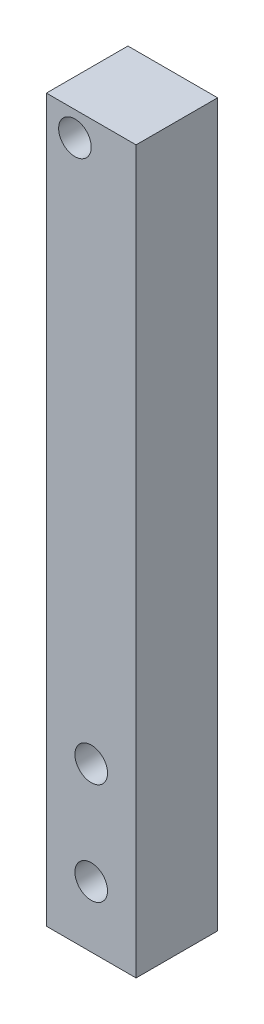
ISO-10303-21;
HEADER;
FILE_DESCRIPTION(('STEP AP214'),'2;1');
FILE_NAME('part.step','',(''),(''),'','','');
FILE_SCHEMA(('AUTOMOTIVE_DESIGN { 1 0 10303 214 1 1 1 1 }'));
ENDSEC;
DATA;
#1=APPLICATION_CONTEXT('core data for automotive mechanical design processes');
#2=APPLICATION_PROTOCOL_DEFINITION('international standard','automotive_design',2000,#1);
#3=PRODUCT_CONTEXT('',#1,'mechanical');
#4=PRODUCT('Part','Part','',(#3));
#5=PRODUCT_RELATED_PRODUCT_CATEGORY('part','',(#4));
#6=PRODUCT_DEFINITION_FORMATION('','',#4);
#7=PRODUCT_DEFINITION_CONTEXT('part definition',#1,'design');
#8=PRODUCT_DEFINITION('design','',#6,#7);
#9=PRODUCT_DEFINITION_SHAPE('','',#8);
#10=(LENGTH_UNIT() NAMED_UNIT(*) SI_UNIT(.MILLI.,.METRE.));
#11=(NAMED_UNIT(*) PLANE_ANGLE_UNIT() SI_UNIT($,.RADIAN.));
#12=(NAMED_UNIT(*) SI_UNIT($,.STERADIAN.) SOLID_ANGLE_UNIT());
#13=UNCERTAINTY_MEASURE_WITH_UNIT(LENGTH_MEASURE(1.E-05),#10,'distance_accuracy_value','');
#14=(GEOMETRIC_REPRESENTATION_CONTEXT(3) GLOBAL_UNCERTAINTY_ASSIGNED_CONTEXT((#13)) GLOBAL_UNIT_ASSIGNED_CONTEXT((#10,
#11,#12)) REPRESENTATION_CONTEXT('',''));
#15=CARTESIAN_POINT('',(0.,0.,0.));
#16=DIRECTION('',(0.,0.,1.));
#17=DIRECTION('',(1.,0.,0.));
#18=AXIS2_PLACEMENT_3D('',#15,#16,#17);
#19=CARTESIAN_POINT('',(0.,0.,20.));
#20=DIRECTION('',(0.,0.,1.));
#21=DIRECTION('',(1.,0.,0.));
#22=AXIS2_PLACEMENT_3D('',#19,#20,#21);
#23=PLANE('',#22);
#24=CARTESIAN_POINT('',(4.00000000000002,-156.,20.));
#25=DIRECTION('',(0.,0.,1.));
#26=DIRECTION('',(1.,0.,0.));
#27=AXIS2_PLACEMENT_3D('',#24,#25,#26);
#28=CIRCLE('',#27,4.);
#29=CARTESIAN_POINT('',(8.00000000000002,-156.,20.));
#30=VERTEX_POINT('',#29);
#31=EDGE_CURVE('E134',#30,#30,#28,.T.);
#32=ORIENTED_EDGE('',*,*,#31,.F.);
#33=EDGE_LOOP('',(#32));
#34=FACE_BOUND('',#33,.T.);
#35=CARTESIAN_POINT('',(4.00000000000002,-131.,20.));
#36=DIRECTION('',(0.,0.,1.));
#37=DIRECTION('',(1.,0.,0.));
#38=AXIS2_PLACEMENT_3D('',#35,#36,#37);
#39=CIRCLE('',#38,4.00000000000001);
#40=CARTESIAN_POINT('',(8.00000000000003,-131.,20.));
#41=VERTEX_POINT('',#40);
#42=EDGE_CURVE('E126',#41,#41,#39,.T.);
#43=ORIENTED_EDGE('',*,*,#42,.F.);
#44=EDGE_LOOP('',(#43));
#45=FACE_BOUND('',#44,.T.);
#46=DIRECTION('',(0.,-1.,0.));
#47=VECTOR('',#46,1.);
#48=CARTESIAN_POINT('',(-7.,6.,20.));
#49=LINE('',#48,#47);
#50=CARTESIAN_POINT('',(-7.,6.,20.));
#51=VERTEX_POINT('',#50);
#52=CARTESIAN_POINT('',(-6.99999999999998,-171.,20.));
#53=VERTEX_POINT('',#52);
#54=EDGE_CURVE('E82',#51,#53,#49,.T.);
#55=ORIENTED_EDGE('',*,*,#54,.T.);
#56=DIRECTION('',(1.,0.,0.));
#57=VECTOR('',#56,1.);
#58=CARTESIAN_POINT('',(-6.99999999999998,-171.,20.));
#59=LINE('',#58,#57);
#60=CARTESIAN_POINT('',(15.,-171.,20.));
#61=VERTEX_POINT('',#60);
#62=EDGE_CURVE('E85',#53,#61,#59,.T.);
#63=ORIENTED_EDGE('',*,*,#62,.T.);
#64=DIRECTION('',(0.,1.,0.));
#65=VECTOR('',#64,1.);
#66=CARTESIAN_POINT('',(15.,-6.,20.));
#67=LINE('',#66,#65);
#68=CARTESIAN_POINT('',(15.,6.,20.));
#69=VERTEX_POINT('',#68);
#70=EDGE_CURVE('E89',#61,#69,#67,.T.);
#71=ORIENTED_EDGE('',*,*,#70,.T.);
#72=DIRECTION('',(-1.,0.,0.));
#73=VECTOR('',#72,1.);
#74=CARTESIAN_POINT('',(-7.,6.,20.));
#75=LINE('',#74,#73);
#76=EDGE_CURVE('E54',#69,#51,#75,.T.);
#77=ORIENTED_EDGE('',*,*,#76,.T.);
#78=EDGE_LOOP('',(#55,#63,#71,#77));
#79=FACE_BOUND('',#78,.T.);
#80=CARTESIAN_POINT('',(0.,0.,20.));
#81=DIRECTION('',(0.,0.,1.));
#82=DIRECTION('',(1.,0.,0.));
#83=AXIS2_PLACEMENT_3D('',#80,#81,#82);
#84=CIRCLE('',#83,4.);
#85=CARTESIAN_POINT('',(4.,0.,20.));
#86=VERTEX_POINT('',#85);
#87=EDGE_CURVE('E103',#86,#86,#84,.T.);
#88=ORIENTED_EDGE('',*,*,#87,.F.);
#89=EDGE_LOOP('',(#88));
#90=FACE_BOUND('',#89,.T.);
#91=ADVANCED_FACE('F37',(#34,#45,#79,#90),#23,.T.);
#92=CARTESIAN_POINT('',(0.,0.,0.));
#93=DIRECTION('',(0.,0.,1.));
#94=DIRECTION('',(1.,0.,0.));
#95=AXIS2_PLACEMENT_3D('',#92,#93,#94);
#96=PLANE('',#95);
#97=CARTESIAN_POINT('',(4.00000000000002,-156.,0.));
#98=DIRECTION('',(0.,0.,1.));
#99=DIRECTION('',(1.,0.,0.));
#100=AXIS2_PLACEMENT_3D('',#97,#98,#99);
#101=CIRCLE('',#100,4.);
#102=CARTESIAN_POINT('',(8.00000000000002,-156.,0.));
#103=VERTEX_POINT('',#102);
#104=EDGE_CURVE('E131',#103,#103,#101,.F.);
#105=ORIENTED_EDGE('',*,*,#104,.F.);
#106=EDGE_LOOP('',(#105));
#107=FACE_BOUND('',#106,.T.);
#108=CARTESIAN_POINT('',(4.00000000000002,-131.,0.));
#109=DIRECTION('',(0.,0.,1.));
#110=DIRECTION('',(1.,0.,0.));
#111=AXIS2_PLACEMENT_3D('',#108,#109,#110);
#112=CIRCLE('',#111,4.00000000000001);
#113=CARTESIAN_POINT('',(8.00000000000003,-131.,0.));
#114=VERTEX_POINT('',#113);
#115=EDGE_CURVE('E121',#114,#114,#112,.F.);
#116=ORIENTED_EDGE('',*,*,#115,.F.);
#117=EDGE_LOOP('',(#116));
#118=FACE_BOUND('',#117,.T.);
#119=DIRECTION('',(0.,-1.,0.));
#120=VECTOR('',#119,1.);
#121=CARTESIAN_POINT('',(-7.,-6.,0.));
#122=LINE('',#121,#120);
#123=CARTESIAN_POINT('',(-7.,6.,0.));
#124=VERTEX_POINT('',#123);
#125=CARTESIAN_POINT('',(-6.99999999999998,-171.,0.));
#126=VERTEX_POINT('',#125);
#127=EDGE_CURVE('E77',#124,#126,#122,.T.);
#128=ORIENTED_EDGE('',*,*,#127,.F.);
#129=DIRECTION('',(-1.,0.,0.));
#130=VECTOR('',#129,1.);
#131=CARTESIAN_POINT('',(-7.,6.,0.));
#132=LINE('',#131,#130);
#133=CARTESIAN_POINT('',(15.,6.,0.));
#134=VERTEX_POINT('',#133);
#135=EDGE_CURVE('E106',#134,#124,#132,.T.);
#136=ORIENTED_EDGE('',*,*,#135,.F.);
#137=DIRECTION('',(0.,1.,0.));
#138=VECTOR('',#137,1.);
#139=CARTESIAN_POINT('',(15.,6.,0.));
#140=LINE('',#139,#138);
#141=CARTESIAN_POINT('',(15.,-171.,0.));
#142=VERTEX_POINT('',#141);
#143=EDGE_CURVE('E70',#142,#134,#140,.T.);
#144=ORIENTED_EDGE('',*,*,#143,.F.);
#145=DIRECTION('',(1.,0.,0.));
#146=VECTOR('',#145,1.);
#147=CARTESIAN_POINT('',(-6.99999999999998,-171.,0.));
#148=LINE('',#147,#146);
#149=EDGE_CURVE('E94',#126,#142,#148,.T.);
#150=ORIENTED_EDGE('',*,*,#149,.F.);
#151=EDGE_LOOP('',(#128,#136,#144,#150));
#152=FACE_BOUND('',#151,.T.);
#153=CARTESIAN_POINT('',(0.,0.,0.));
#154=DIRECTION('',(0.,0.,1.));
#155=DIRECTION('',(1.,0.,0.));
#156=AXIS2_PLACEMENT_3D('',#153,#154,#155);
#157=CIRCLE('',#156,4.);
#158=CARTESIAN_POINT('',(4.,0.,0.));
#159=VERTEX_POINT('',#158);
#160=EDGE_CURVE('E119',#159,#159,#157,.T.);
#161=ORIENTED_EDGE('',*,*,#160,.T.);
#162=EDGE_LOOP('',(#161));
#163=FACE_BOUND('',#162,.T.);
#164=ADVANCED_FACE('F112',(#107,#118,#152,#163),#96,.F.);
#165=CARTESIAN_POINT('',(-7.,-6.,20.));
#166=DIRECTION('',(1.,0.,0.));
#167=DIRECTION('',(0.,1.,0.));
#168=AXIS2_PLACEMENT_3D('',#165,#166,#167);
#169=PLANE('',#168);
#170=ORIENTED_EDGE('',*,*,#127,.T.);
#171=DIRECTION('',(0.,0.,-1.));
#172=VECTOR('',#171,1.);
#173=CARTESIAN_POINT('',(-6.99999999999998,-171.,20.));
#174=LINE('',#173,#172);
#175=EDGE_CURVE('E11',#53,#126,#174,.T.);
#176=ORIENTED_EDGE('',*,*,#175,.F.);
#177=ORIENTED_EDGE('',*,*,#54,.F.);
#178=DIRECTION('',(0.,0.,-1.));
#179=VECTOR('',#178,1.);
#180=CARTESIAN_POINT('',(-7.,6.,20.));
#181=LINE('',#180,#179);
#182=EDGE_CURVE('E98',#51,#124,#181,.T.);
#183=ORIENTED_EDGE('',*,*,#182,.T.);
#184=EDGE_LOOP('',(#170,#176,#177,#183));
#185=FACE_BOUND('',#184,.T.);
#186=ADVANCED_FACE('F39',(#185),#169,.F.);
#187=CARTESIAN_POINT('',(-6.99999999999998,-171.,20.));
#188=DIRECTION('',(0.,1.,0.));
#189=DIRECTION('',(0.,0.,1.));
#190=AXIS2_PLACEMENT_3D('',#187,#188,#189);
#191=PLANE('',#190);
#192=ORIENTED_EDGE('',*,*,#149,.T.);
#193=DIRECTION('',(0.,0.,-1.));
#194=VECTOR('',#193,1.);
#195=CARTESIAN_POINT('',(15.,-171.,20.));
#196=LINE('',#195,#194);
#197=EDGE_CURVE('E46',#61,#142,#196,.T.);
#198=ORIENTED_EDGE('',*,*,#197,.F.);
#199=ORIENTED_EDGE('',*,*,#62,.F.);
#200=ORIENTED_EDGE('',*,*,#175,.T.);
#201=EDGE_LOOP('',(#192,#198,#199,#200));
#202=FACE_BOUND('',#201,.T.);
#203=ADVANCED_FACE('F93',(#202),#191,.F.);
#204=CARTESIAN_POINT('',(15.,6.,20.));
#205=DIRECTION('',(-1.,0.,0.));
#206=DIRECTION('',(0.,0.,1.));
#207=AXIS2_PLACEMENT_3D('',#204,#205,#206);
#208=PLANE('',#207);
#209=ORIENTED_EDGE('',*,*,#143,.T.);
#210=DIRECTION('',(0.,0.,-1.));
#211=VECTOR('',#210,1.);
#212=CARTESIAN_POINT('',(15.,6.,20.));
#213=LINE('',#212,#211);
#214=EDGE_CURVE('E95',#69,#134,#213,.T.);
#215=ORIENTED_EDGE('',*,*,#214,.F.);
#216=ORIENTED_EDGE('',*,*,#70,.F.);
#217=ORIENTED_EDGE('',*,*,#197,.T.);
#218=EDGE_LOOP('',(#209,#215,#216,#217));
#219=FACE_BOUND('',#218,.T.);
#220=ADVANCED_FACE('F96',(#219),#208,.F.);
#221=CARTESIAN_POINT('',(-7.,6.,20.));
#222=DIRECTION('',(0.,-1.,0.));
#223=DIRECTION('',(0.,0.,-1.));
#224=AXIS2_PLACEMENT_3D('',#221,#222,#223);
#225=PLANE('',#224);
#226=ORIENTED_EDGE('',*,*,#135,.T.);
#227=ORIENTED_EDGE('',*,*,#182,.F.);
#228=ORIENTED_EDGE('',*,*,#76,.F.);
#229=ORIENTED_EDGE('',*,*,#214,.T.);
#230=EDGE_LOOP('',(#226,#227,#228,#229));
#231=FACE_BOUND('',#230,.T.);
#232=ADVANCED_FACE('F111',(#231),#225,.F.);
#233=CARTESIAN_POINT('',(0.,0.,20.));
#234=DIRECTION('',(0.,0.,-1.));
#235=DIRECTION('',(-1.,0.,0.));
#236=AXIS2_PLACEMENT_3D('',#233,#234,#235);
#237=CYLINDRICAL_SURFACE('',#236,4.);
#238=ORIENTED_EDGE('',*,*,#87,.T.);
#239=EDGE_LOOP('',(#238));
#240=FACE_BOUND('',#239,.T.);
#241=ORIENTED_EDGE('',*,*,#160,.F.);
#242=EDGE_LOOP('',(#241));
#243=FACE_BOUND('',#242,.T.);
#244=ADVANCED_FACE('F149',(#240,#243),#237,.F.);
#245=CARTESIAN_POINT('',(4.00000000000002,-131.,-0.001000000000001));
#246=DIRECTION('',(0.,0.,1.));
#247=DIRECTION('',(1.,0.,0.));
#248=AXIS2_PLACEMENT_3D('',#245,#246,#247);
#249=CYLINDRICAL_SURFACE('',#248,4.00000000000001);
#250=ORIENTED_EDGE('',*,*,#42,.T.);
#251=EDGE_LOOP('',(#250));
#252=FACE_BOUND('',#251,.T.);
#253=ORIENTED_EDGE('',*,*,#115,.T.);
#254=EDGE_LOOP('',(#253));
#255=FACE_BOUND('',#254,.T.);
#256=ADVANCED_FACE('F146',(#252,#255),#249,.F.);
#257=CARTESIAN_POINT('',(4.00000000000002,-156.,-0.001000000000001));
#258=DIRECTION('',(0.,0.,1.));
#259=DIRECTION('',(1.,0.,0.));
#260=AXIS2_PLACEMENT_3D('',#257,#258,#259);
#261=CYLINDRICAL_SURFACE('',#260,4.);
#262=ORIENTED_EDGE('',*,*,#31,.T.);
#263=EDGE_LOOP('',(#262));
#264=FACE_BOUND('',#263,.T.);
#265=ORIENTED_EDGE('',*,*,#104,.T.);
#266=EDGE_LOOP('',(#265));
#267=FACE_BOUND('',#266,.T.);
#268=ADVANCED_FACE('F138',(#264,#267),#261,.F.);
#269=CLOSED_SHELL('',(#91,#164,#186,#203,#220,#232,#244,#256,#268));
#270=MANIFOLD_SOLID_BREP('B2',#269);
#271=ADVANCED_BREP_SHAPE_REPRESENTATION('',(#18,#270),#14);
#272=SHAPE_DEFINITION_REPRESENTATION(#9,#271);
ENDSEC;
END-ISO-10303-21;
